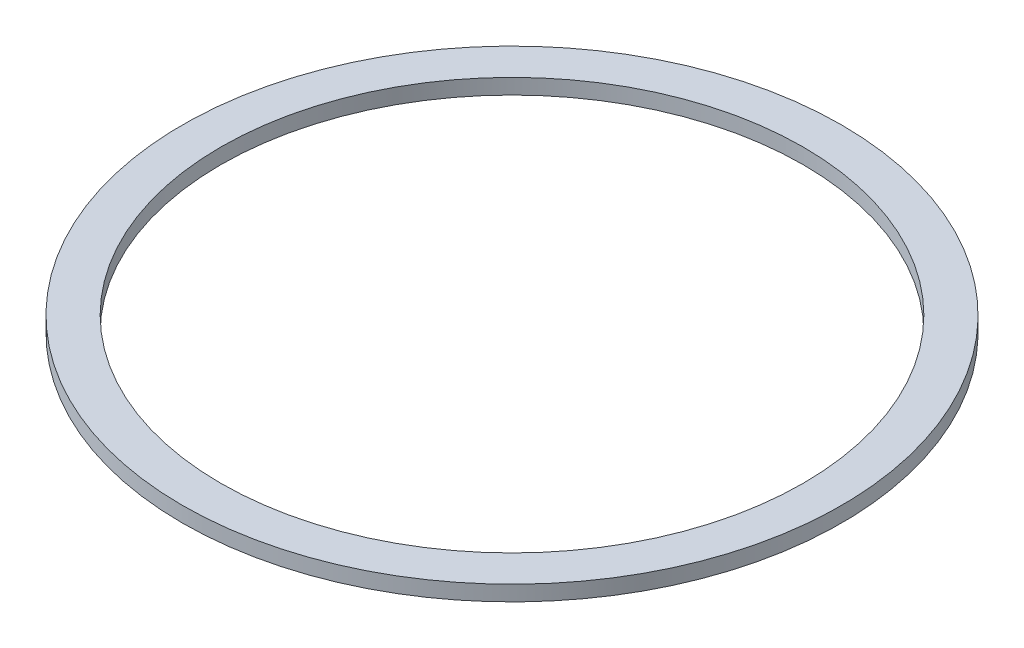
ISO-10303-21;
HEADER;
FILE_DESCRIPTION(('STEP AP214'),'2;1');
FILE_NAME('part.step','',(''),(''),'','','');
FILE_SCHEMA(('AUTOMOTIVE_DESIGN { 1 0 10303 214 1 1 1 1 }'));
ENDSEC;
DATA;
#1=APPLICATION_CONTEXT('core data for automotive mechanical design processes');
#2=APPLICATION_PROTOCOL_DEFINITION('international standard','automotive_design',2000,#1);
#3=PRODUCT_CONTEXT('',#1,'mechanical');
#4=PRODUCT('Part','Part','',(#3));
#5=PRODUCT_RELATED_PRODUCT_CATEGORY('part','',(#4));
#6=PRODUCT_DEFINITION_FORMATION('','',#4);
#7=PRODUCT_DEFINITION_CONTEXT('part definition',#1,'design');
#8=PRODUCT_DEFINITION('design','',#6,#7);
#9=PRODUCT_DEFINITION_SHAPE('','',#8);
#10=(LENGTH_UNIT() NAMED_UNIT(*) SI_UNIT(.MILLI.,.METRE.));
#11=(NAMED_UNIT(*) PLANE_ANGLE_UNIT() SI_UNIT($,.RADIAN.));
#12=(NAMED_UNIT(*) SI_UNIT($,.STERADIAN.) SOLID_ANGLE_UNIT());
#13=UNCERTAINTY_MEASURE_WITH_UNIT(LENGTH_MEASURE(1.E-05),#10,'distance_accuracy_value','');
#14=(GEOMETRIC_REPRESENTATION_CONTEXT(3) GLOBAL_UNCERTAINTY_ASSIGNED_CONTEXT((#13)) GLOBAL_UNIT_ASSIGNED_CONTEXT((#10,
#11,#12)) REPRESENTATION_CONTEXT('',''));
#15=CARTESIAN_POINT('',(0.,0.,0.));
#16=DIRECTION('',(0.,0.,1.));
#17=DIRECTION('',(1.,0.,0.));
#18=AXIS2_PLACEMENT_3D('',#15,#16,#17);
#19=CARTESIAN_POINT('',(0.,-134.,105.));
#20=DIRECTION('',(0.,1.,0.));
#21=DIRECTION('',(0.,0.,1.));
#22=AXIS2_PLACEMENT_3D('',#19,#20,#21);
#23=CYLINDRICAL_SURFACE('',#22,38.);
#24=DIRECTION('',(0.,1.,0.));
#25=VECTOR('',#24,1.);
#26=CARTESIAN_POINT('',(0.,-134.,143.));
#27=LINE('',#26,#25);
#28=CARTESIAN_POINT('',(0.,-134.,143.));
#29=VERTEX_POINT('',#28);
#30=CARTESIAN_POINT('',(0.,-132.,143.));
#31=VERTEX_POINT('',#30);
#32=EDGE_CURVE('E10',#29,#31,#27,.T.);
#33=ORIENTED_EDGE('',*,*,#32,.F.);
#34=CARTESIAN_POINT('',(0.,-134.,105.));
#35=DIRECTION('',(0.,1.,0.));
#36=DIRECTION('',(0.,0.,1.));
#37=AXIS2_PLACEMENT_3D('',#34,#35,#36);
#38=CIRCLE('',#37,38.);
#39=EDGE_CURVE('E25',#29,#29,#38,.T.);
#40=ORIENTED_EDGE('',*,*,#39,.F.);
#41=ORIENTED_EDGE('',*,*,#32,.T.);
#42=CARTESIAN_POINT('',(0.,-132.,105.));
#43=DIRECTION('',(0.,1.,0.));
#44=DIRECTION('',(0.,0.,1.));
#45=AXIS2_PLACEMENT_3D('',#42,#43,#44);
#46=CIRCLE('',#45,38.);
#47=EDGE_CURVE('E19',#31,#31,#46,.T.);
#48=ORIENTED_EDGE('',*,*,#47,.T.);
#49=EDGE_LOOP('',(#33,#40,#41,#48));
#50=FACE_BOUND('',#49,.T.);
#51=ADVANCED_FACE('F16',(#50),#23,.F.);
#52=CARTESIAN_POINT('',(0.,-134.,105.));
#53=DIRECTION('',(0.,1.,0.));
#54=DIRECTION('',(1.,0.,0.));
#55=AXIS2_PLACEMENT_3D('',#52,#53,#54);
#56=PLANE('',#55);
#57=ORIENTED_EDGE('',*,*,#39,.T.);
#58=EDGE_LOOP('',(#57));
#59=FACE_BOUND('',#58,.T.);
#60=CARTESIAN_POINT('',(0.,-134.,105.));
#61=DIRECTION('',(0.,1.,0.));
#62=DIRECTION('',(0.,0.,1.));
#63=AXIS2_PLACEMENT_3D('',#60,#61,#62);
#64=CIRCLE('',#63,43.);
#65=CARTESIAN_POINT('',(0.,-134.,148.));
#66=VERTEX_POINT('',#65);
#67=EDGE_CURVE('E57',#66,#66,#64,.T.);
#68=ORIENTED_EDGE('',*,*,#67,.F.);
#69=EDGE_LOOP('',(#68));
#70=FACE_BOUND('',#69,.T.);
#71=ADVANCED_FACE('F76',(#59,#70),#56,.F.);
#72=CARTESIAN_POINT('',(0.,-132.,105.));
#73=DIRECTION('',(0.,1.,0.));
#74=DIRECTION('',(1.,0.,0.));
#75=AXIS2_PLACEMENT_3D('',#72,#73,#74);
#76=PLANE('',#75);
#77=ORIENTED_EDGE('',*,*,#47,.F.);
#78=EDGE_LOOP('',(#77));
#79=FACE_BOUND('',#78,.T.);
#80=CARTESIAN_POINT('',(0.,-132.,105.));
#81=DIRECTION('',(0.,1.,0.));
#82=DIRECTION('',(0.,0.,1.));
#83=AXIS2_PLACEMENT_3D('',#80,#81,#82);
#84=CIRCLE('',#83,43.);
#85=CARTESIAN_POINT('',(0.,-132.,148.));
#86=VERTEX_POINT('',#85);
#87=EDGE_CURVE('E55',#86,#86,#84,.T.);
#88=ORIENTED_EDGE('',*,*,#87,.T.);
#89=EDGE_LOOP('',(#88));
#90=FACE_BOUND('',#89,.T.);
#91=ADVANCED_FACE('F61',(#79,#90),#76,.T.);
#92=CARTESIAN_POINT('',(0.,-134.,105.));
#93=DIRECTION('',(0.,1.,0.));
#94=DIRECTION('',(0.,0.,1.));
#95=AXIS2_PLACEMENT_3D('',#92,#93,#94);
#96=CYLINDRICAL_SURFACE('',#95,43.);
#97=ORIENTED_EDGE('',*,*,#87,.F.);
#98=DIRECTION('',(0.,1.,0.));
#99=VECTOR('',#98,1.);
#100=CARTESIAN_POINT('',(0.,-134.,148.));
#101=LINE('',#100,#99);
#102=EDGE_CURVE('E52',#66,#86,#101,.T.);
#103=ORIENTED_EDGE('',*,*,#102,.F.);
#104=ORIENTED_EDGE('',*,*,#67,.T.);
#105=ORIENTED_EDGE('',*,*,#102,.T.);
#106=EDGE_LOOP('',(#97,#103,#104,#105));
#107=FACE_BOUND('',#106,.T.);
#108=ADVANCED_FACE('F54',(#107),#96,.T.);
#109=CLOSED_SHELL('',(#51,#71,#91,#108));
#110=MANIFOLD_SOLID_BREP('B1',#109);
#111=ADVANCED_BREP_SHAPE_REPRESENTATION('',(#18,#110),#14);
#112=SHAPE_DEFINITION_REPRESENTATION(#9,#111);
ENDSEC;
END-ISO-10303-21;
